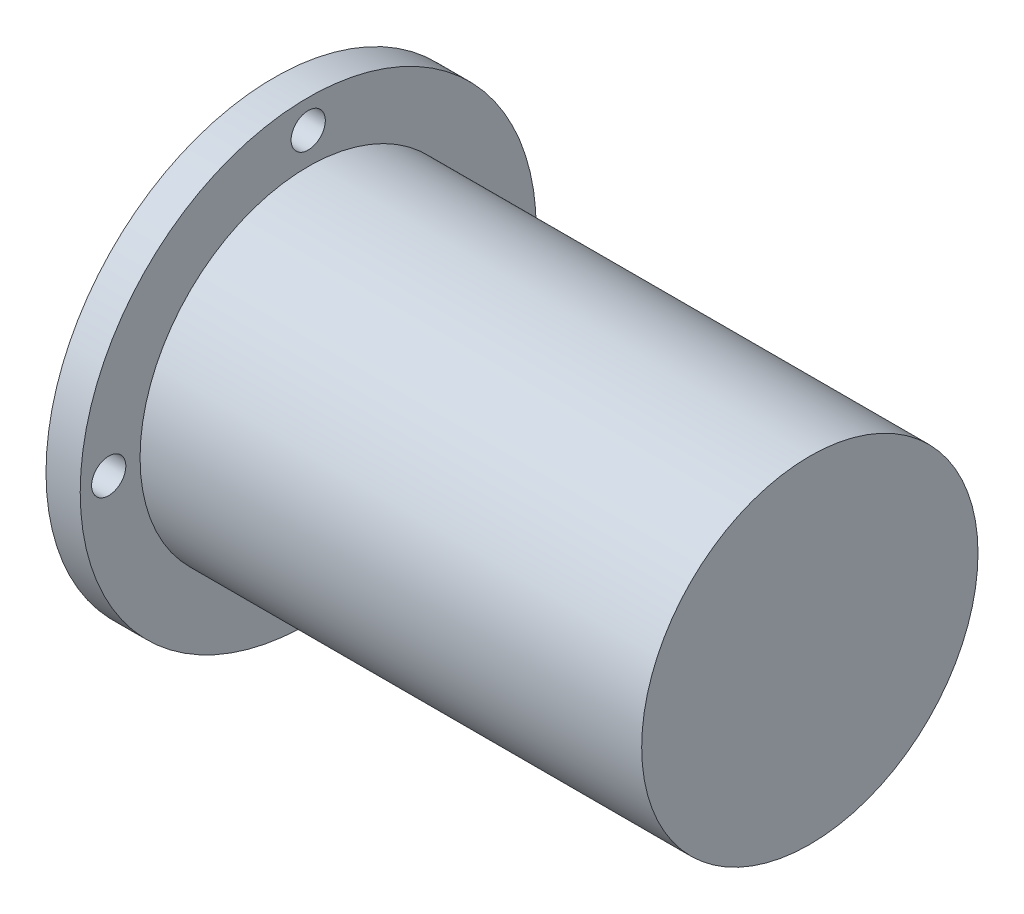
ISO-10303-21;
HEADER;
FILE_DESCRIPTION(('STEP AP214'),'2;1');
FILE_NAME('part.step','',(''),(''),'','','');
FILE_SCHEMA(('AUTOMOTIVE_DESIGN { 1 0 10303 214 1 1 1 1 }'));
ENDSEC;
DATA;
#1=APPLICATION_CONTEXT('core data for automotive mechanical design processes');
#2=APPLICATION_PROTOCOL_DEFINITION('international standard','automotive_design',2000,#1);
#3=PRODUCT_CONTEXT('',#1,'mechanical');
#4=PRODUCT('Part','Part','',(#3));
#5=PRODUCT_RELATED_PRODUCT_CATEGORY('part','',(#4));
#6=PRODUCT_DEFINITION_FORMATION('','',#4);
#7=PRODUCT_DEFINITION_CONTEXT('part definition',#1,'design');
#8=PRODUCT_DEFINITION('design','',#6,#7);
#9=PRODUCT_DEFINITION_SHAPE('','',#8);
#10=(LENGTH_UNIT() NAMED_UNIT(*) SI_UNIT(.MILLI.,.METRE.));
#11=(NAMED_UNIT(*) PLANE_ANGLE_UNIT() SI_UNIT($,.RADIAN.));
#12=(NAMED_UNIT(*) SI_UNIT($,.STERADIAN.) SOLID_ANGLE_UNIT());
#13=UNCERTAINTY_MEASURE_WITH_UNIT(LENGTH_MEASURE(1.E-05),#10,'distance_accuracy_value','');
#14=(GEOMETRIC_REPRESENTATION_CONTEXT(3) GLOBAL_UNCERTAINTY_ASSIGNED_CONTEXT((#13)) GLOBAL_UNIT_ASSIGNED_CONTEXT((#10,
#11,#12)) REPRESENTATION_CONTEXT('',''));
#15=CARTESIAN_POINT('',(0.,0.,0.));
#16=DIRECTION('',(0.,0.,1.));
#17=DIRECTION('',(1.,0.,0.));
#18=AXIS2_PLACEMENT_3D('',#15,#16,#17);
#19=CARTESIAN_POINT('',(47.,0.,0.));
#20=DIRECTION('',(-1.,0.,0.));
#21=DIRECTION('',(0.,0.,1.));
#22=AXIS2_PLACEMENT_3D('',#19,#20,#21);
#23=CYLINDRICAL_SURFACE('',#22,14.75);
#24=CARTESIAN_POINT('',(47.,0.,0.));
#25=DIRECTION('',(1.,0.,0.));
#26=DIRECTION('',(0.,0.,-1.));
#27=AXIS2_PLACEMENT_3D('',#24,#25,#26);
#28=CIRCLE('',#27,14.75);
#29=CARTESIAN_POINT('',(47.,0.,-14.75));
#30=VERTEX_POINT('',#29);
#31=EDGE_CURVE('E44',#30,#30,#28,.T.);
#32=ORIENTED_EDGE('',*,*,#31,.F.);
#33=EDGE_LOOP('',(#32));
#34=FACE_BOUND('',#33,.T.);
#35=CARTESIAN_POINT('',(3.,0.,0.));
#36=DIRECTION('',(-1.,0.,0.));
#37=DIRECTION('',(0.,0.,1.));
#38=AXIS2_PLACEMENT_3D('',#35,#36,#37);
#39=CIRCLE('',#38,14.75);
#40=CARTESIAN_POINT('',(3.,0.,14.75));
#41=VERTEX_POINT('',#40);
#42=EDGE_CURVE('E10',#41,#41,#39,.T.);
#43=ORIENTED_EDGE('',*,*,#42,.F.);
#44=EDGE_LOOP('',(#43));
#45=FACE_BOUND('',#44,.T.);
#46=ADVANCED_FACE('F39',(#34,#45),#23,.T.);
#47=CARTESIAN_POINT('',(47.,0.,0.));
#48=DIRECTION('',(1.,0.,0.));
#49=DIRECTION('',(0.,0.,-1.));
#50=AXIS2_PLACEMENT_3D('',#47,#48,#49);
#51=PLANE('',#50);
#52=ORIENTED_EDGE('',*,*,#31,.T.);
#53=EDGE_LOOP('',(#52));
#54=FACE_BOUND('',#53,.T.);
#55=ADVANCED_FACE('F106',(#54),#51,.T.);
#56=CARTESIAN_POINT('',(3.,0.,0.));
#57=DIRECTION('',(-1.,0.,0.));
#58=DIRECTION('',(0.,0.,1.));
#59=AXIS2_PLACEMENT_3D('',#56,#57,#58);
#60=CYLINDRICAL_SURFACE('',#59,20.);
#61=CARTESIAN_POINT('',(3.,0.,0.));
#62=DIRECTION('',(-1.,0.,0.));
#63=DIRECTION('',(0.,0.,1.));
#64=AXIS2_PLACEMENT_3D('',#61,#62,#63);
#65=CIRCLE('',#64,20.);
#66=CARTESIAN_POINT('',(3.,0.,20.));
#67=VERTEX_POINT('',#66);
#68=EDGE_CURVE('E47',#67,#67,#65,.T.);
#69=ORIENTED_EDGE('',*,*,#68,.T.);
#70=EDGE_LOOP('',(#69));
#71=FACE_BOUND('',#70,.T.);
#72=CARTESIAN_POINT('',(0.,0.,0.));
#73=DIRECTION('',(-1.,0.,0.));
#74=DIRECTION('',(0.,0.,1.));
#75=AXIS2_PLACEMENT_3D('',#72,#73,#74);
#76=CIRCLE('',#75,20.);
#77=CARTESIAN_POINT('',(0.,0.,20.));
#78=VERTEX_POINT('',#77);
#79=EDGE_CURVE('E52',#78,#78,#76,.T.);
#80=ORIENTED_EDGE('',*,*,#79,.F.);
#81=EDGE_LOOP('',(#80));
#82=FACE_BOUND('',#81,.T.);
#83=ADVANCED_FACE('F102',(#71,#82),#60,.T.);
#84=CARTESIAN_POINT('',(3.,0.,0.));
#85=DIRECTION('',(-1.,0.,0.));
#86=DIRECTION('',(0.,0.,1.));
#87=AXIS2_PLACEMENT_3D('',#84,#85,#86);
#88=PLANE('',#87);
#89=ORIENTED_EDGE('',*,*,#42,.T.);
#90=EDGE_LOOP('',(#89));
#91=FACE_BOUND('',#90,.T.);
#92=CARTESIAN_POINT('',(3.,1.83302770289265E-13,-17.5));
#93=DIRECTION('',(-1.,0.,0.));
#94=DIRECTION('',(0.,0.,1.));
#95=AXIS2_PLACEMENT_3D('',#92,#93,#94);
#96=CIRCLE('',#95,1.5);
#97=CARTESIAN_POINT('',(3.,1.83302770289265E-13,-16.));
#98=VERTEX_POINT('',#97);
#99=EDGE_CURVE('E74',#98,#98,#96,.T.);
#100=ORIENTED_EDGE('',*,*,#99,.T.);
#101=EDGE_LOOP('',(#100));
#102=FACE_BOUND('',#101,.T.);
#103=CARTESIAN_POINT('',(3.,-17.5,-1.2220184685951E-13));
#104=DIRECTION('',(-1.,0.,0.));
#105=DIRECTION('',(0.,0.,1.));
#106=AXIS2_PLACEMENT_3D('',#103,#104,#105);
#107=CIRCLE('',#106,1.5);
#108=CARTESIAN_POINT('',(3.,-17.5,1.49999999999988));
#109=VERTEX_POINT('',#108);
#110=EDGE_CURVE('E68',#109,#109,#107,.T.);
#111=ORIENTED_EDGE('',*,*,#110,.T.);
#112=EDGE_LOOP('',(#111));
#113=FACE_BOUND('',#112,.T.);
#114=CARTESIAN_POINT('',(3.,0.,17.5));
#115=DIRECTION('',(-1.,0.,0.));
#116=DIRECTION('',(0.,0.,1.));
#117=AXIS2_PLACEMENT_3D('',#114,#115,#116);
#118=CIRCLE('',#117,1.5);
#119=CARTESIAN_POINT('',(3.,0.,19.));
#120=VERTEX_POINT('',#119);
#121=EDGE_CURVE('E65',#120,#120,#118,.T.);
#122=ORIENTED_EDGE('',*,*,#121,.T.);
#123=EDGE_LOOP('',(#122));
#124=FACE_BOUND('',#123,.T.);
#125=CARTESIAN_POINT('',(3.,17.5,0.));
#126=DIRECTION('',(-1.,0.,0.));
#127=DIRECTION('',(0.,0.,1.));
#128=AXIS2_PLACEMENT_3D('',#125,#126,#127);
#129=CIRCLE('',#128,1.5);
#130=CARTESIAN_POINT('',(3.,17.5,1.5));
#131=VERTEX_POINT('',#130);
#132=EDGE_CURVE('E60',#131,#131,#129,.T.);
#133=ORIENTED_EDGE('',*,*,#132,.T.);
#134=EDGE_LOOP('',(#133));
#135=FACE_BOUND('',#134,.T.);
#136=ORIENTED_EDGE('',*,*,#68,.F.);
#137=EDGE_LOOP('',(#136));
#138=FACE_BOUND('',#137,.T.);
#139=ADVANCED_FACE('F83',(#91,#102,#113,#124,#135,#138),#88,.F.);
#140=CARTESIAN_POINT('',(3.,17.5,0.));
#141=DIRECTION('',(-1.,0.,0.));
#142=DIRECTION('',(0.,0.,1.));
#143=AXIS2_PLACEMENT_3D('',#140,#141,#142);
#144=CYLINDRICAL_SURFACE('',#143,1.5);
#145=ORIENTED_EDGE('',*,*,#132,.F.);
#146=EDGE_LOOP('',(#145));
#147=FACE_BOUND('',#146,.T.);
#148=CARTESIAN_POINT('',(0.,17.5,0.));
#149=DIRECTION('',(-1.,0.,0.));
#150=DIRECTION('',(0.,0.,1.));
#151=AXIS2_PLACEMENT_3D('',#148,#149,#150);
#152=CIRCLE('',#151,1.5);
#153=CARTESIAN_POINT('',(0.,17.5,1.5));
#154=VERTEX_POINT('',#153);
#155=EDGE_CURVE('E56',#154,#154,#152,.T.);
#156=ORIENTED_EDGE('',*,*,#155,.T.);
#157=EDGE_LOOP('',(#156));
#158=FACE_BOUND('',#157,.T.);
#159=ADVANCED_FACE('F114',(#147,#158),#144,.F.);
#160=CARTESIAN_POINT('',(3.,0.,17.5));
#161=DIRECTION('',(-1.,0.,0.));
#162=DIRECTION('',(0.,0.,1.));
#163=AXIS2_PLACEMENT_3D('',#160,#161,#162);
#164=CYLINDRICAL_SURFACE('',#163,1.5);
#165=ORIENTED_EDGE('',*,*,#121,.F.);
#166=EDGE_LOOP('',(#165));
#167=FACE_BOUND('',#166,.T.);
#168=CARTESIAN_POINT('',(0.,0.,17.5));
#169=DIRECTION('',(-1.,0.,0.));
#170=DIRECTION('',(0.,0.,1.));
#171=AXIS2_PLACEMENT_3D('',#168,#169,#170);
#172=CIRCLE('',#171,1.5);
#173=CARTESIAN_POINT('',(0.,0.,19.));
#174=VERTEX_POINT('',#173);
#175=EDGE_CURVE('E62',#174,#174,#172,.T.);
#176=ORIENTED_EDGE('',*,*,#175,.T.);
#177=EDGE_LOOP('',(#176));
#178=FACE_BOUND('',#177,.T.);
#179=ADVANCED_FACE('F156',(#167,#178),#164,.F.);
#180=CARTESIAN_POINT('',(3.,-17.5,-1.2220184685951E-13));
#181=DIRECTION('',(-1.,0.,0.));
#182=DIRECTION('',(0.,0.,1.));
#183=AXIS2_PLACEMENT_3D('',#180,#181,#182);
#184=CYLINDRICAL_SURFACE('',#183,1.5);
#185=ORIENTED_EDGE('',*,*,#110,.F.);
#186=EDGE_LOOP('',(#185));
#187=FACE_BOUND('',#186,.T.);
#188=CARTESIAN_POINT('',(0.,-17.5,-1.2220184685951E-13));
#189=DIRECTION('',(-1.,0.,0.));
#190=DIRECTION('',(0.,0.,1.));
#191=AXIS2_PLACEMENT_3D('',#188,#189,#190);
#192=CIRCLE('',#191,1.5);
#193=CARTESIAN_POINT('',(0.,-17.5,1.49999999999988));
#194=VERTEX_POINT('',#193);
#195=EDGE_CURVE('E72',#194,#194,#192,.T.);
#196=ORIENTED_EDGE('',*,*,#195,.T.);
#197=EDGE_LOOP('',(#196));
#198=FACE_BOUND('',#197,.T.);
#199=ADVANCED_FACE('F89',(#187,#198),#184,.F.);
#200=CARTESIAN_POINT('',(3.,1.83302770289265E-13,-17.5));
#201=DIRECTION('',(-1.,0.,0.));
#202=DIRECTION('',(0.,0.,1.));
#203=AXIS2_PLACEMENT_3D('',#200,#201,#202);
#204=CYLINDRICAL_SURFACE('',#203,1.5);
#205=ORIENTED_EDGE('',*,*,#99,.F.);
#206=EDGE_LOOP('',(#205));
#207=FACE_BOUND('',#206,.T.);
#208=CARTESIAN_POINT('',(0.,1.83302770289265E-13,-17.5));
#209=DIRECTION('',(-1.,0.,0.));
#210=DIRECTION('',(0.,0.,1.));
#211=AXIS2_PLACEMENT_3D('',#208,#209,#210);
#212=CIRCLE('',#211,1.5);
#213=CARTESIAN_POINT('',(0.,1.83302770289265E-13,-16.));
#214=VERTEX_POINT('',#213);
#215=EDGE_CURVE('E80',#214,#214,#212,.T.);
#216=ORIENTED_EDGE('',*,*,#215,.T.);
#217=EDGE_LOOP('',(#216));
#218=FACE_BOUND('',#217,.T.);
#219=ADVANCED_FACE('F88',(#207,#218),#204,.F.);
#220=CARTESIAN_POINT('',(0.,0.,0.));
#221=DIRECTION('',(1.,0.,0.));
#222=DIRECTION('',(0.,0.,-1.));
#223=AXIS2_PLACEMENT_3D('',#220,#221,#222);
#224=PLANE('',#223);
#225=ORIENTED_EDGE('',*,*,#215,.F.);
#226=EDGE_LOOP('',(#225));
#227=FACE_BOUND('',#226,.T.);
#228=ORIENTED_EDGE('',*,*,#195,.F.);
#229=EDGE_LOOP('',(#228));
#230=FACE_BOUND('',#229,.T.);
#231=ORIENTED_EDGE('',*,*,#175,.F.);
#232=EDGE_LOOP('',(#231));
#233=FACE_BOUND('',#232,.T.);
#234=ORIENTED_EDGE('',*,*,#155,.F.);
#235=EDGE_LOOP('',(#234));
#236=FACE_BOUND('',#235,.T.);
#237=ORIENTED_EDGE('',*,*,#79,.T.);
#238=EDGE_LOOP('',(#237));
#239=FACE_BOUND('',#238,.T.);
#240=ADVANCED_FACE('F90',(#227,#230,#233,#236,#239),#224,.F.);
#241=CLOSED_SHELL('',(#46,#55,#83,#139,#159,#179,#199,#219,#240));
#242=MANIFOLD_SOLID_BREP('B2',#241);
#243=ADVANCED_BREP_SHAPE_REPRESENTATION('',(#18,#242),#14);
#244=SHAPE_DEFINITION_REPRESENTATION(#9,#243);
ENDSEC;
END-ISO-10303-21;
